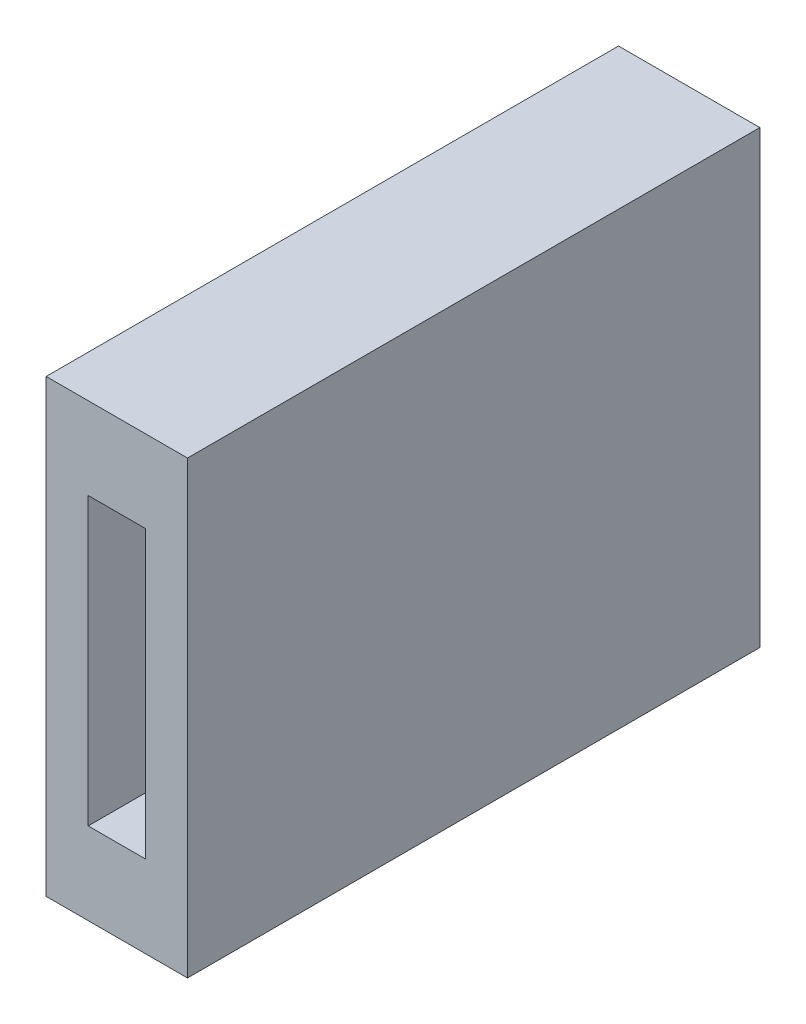
ISO-10303-21;
HEADER;
FILE_DESCRIPTION(('STEP AP214'),'2;1');
FILE_NAME('part.step','',(''),(''),'','','');
FILE_SCHEMA(('AUTOMOTIVE_DESIGN { 1 0 10303 214 1 1 1 1 }'));
ENDSEC;
DATA;
#1=APPLICATION_CONTEXT('core data for automotive mechanical design processes');
#2=APPLICATION_PROTOCOL_DEFINITION('international standard','automotive_design',2000,#1);
#3=PRODUCT_CONTEXT('',#1,'mechanical');
#4=PRODUCT('Part','Part','',(#3));
#5=PRODUCT_RELATED_PRODUCT_CATEGORY('part','',(#4));
#6=PRODUCT_DEFINITION_FORMATION('','',#4);
#7=PRODUCT_DEFINITION_CONTEXT('part definition',#1,'design');
#8=PRODUCT_DEFINITION('design','',#6,#7);
#9=PRODUCT_DEFINITION_SHAPE('','',#8);
#10=(LENGTH_UNIT() NAMED_UNIT(*) SI_UNIT(.MILLI.,.METRE.));
#11=(NAMED_UNIT(*) PLANE_ANGLE_UNIT() SI_UNIT($,.RADIAN.));
#12=(NAMED_UNIT(*) SI_UNIT($,.STERADIAN.) SOLID_ANGLE_UNIT());
#13=UNCERTAINTY_MEASURE_WITH_UNIT(LENGTH_MEASURE(1.E-05),#10,'distance_accuracy_value','');
#14=(GEOMETRIC_REPRESENTATION_CONTEXT(3) GLOBAL_UNCERTAINTY_ASSIGNED_CONTEXT((#13)) GLOBAL_UNIT_ASSIGNED_CONTEXT((#10,
#11,#12)) REPRESENTATION_CONTEXT('',''));
#15=CARTESIAN_POINT('',(0.,0.,0.));
#16=DIRECTION('',(0.,0.,1.));
#17=DIRECTION('',(1.,0.,0.));
#18=AXIS2_PLACEMENT_3D('',#15,#16,#17);
#19=CARTESIAN_POINT('',(0.,0.,50.));
#20=DIRECTION('',(0.,0.,-1.));
#21=DIRECTION('',(-1.,0.,0.));
#22=AXIS2_PLACEMENT_3D('',#19,#20,#21);
#23=PLANE('',#22);
#24=DIRECTION('',(0.,1.,0.));
#25=VECTOR('',#24,1.);
#26=CARTESIAN_POINT('',(6.1720698254364,-19.6695760598504,50.));
#27=LINE('',#26,#25);
#28=CARTESIAN_POINT('',(6.1720698254364,-19.6695760598504,50.));
#29=VERTEX_POINT('',#28);
#30=CARTESIAN_POINT('',(6.1720698254364,19.6695760598504,50.));
#31=VERTEX_POINT('',#30);
#32=EDGE_CURVE('E134',#29,#31,#27,.T.);
#33=ORIENTED_EDGE('',*,*,#32,.T.);
#34=DIRECTION('',(-1.,0.,0.));
#35=VECTOR('',#34,1.);
#36=CARTESIAN_POINT('',(-6.1720698254364,19.6695760598504,50.));
#37=LINE('',#36,#35);
#38=CARTESIAN_POINT('',(-6.1720698254364,19.6695760598504,50.));
#39=VERTEX_POINT('',#38);
#40=EDGE_CURVE('E137',#31,#39,#37,.T.);
#41=ORIENTED_EDGE('',*,*,#40,.T.);
#42=DIRECTION('',(0.,-1.,0.));
#43=VECTOR('',#42,1.);
#44=CARTESIAN_POINT('',(-6.1720698254364,-19.6695760598504,50.));
#45=LINE('',#44,#43);
#46=CARTESIAN_POINT('',(-6.1720698254364,-19.6695760598504,50.));
#47=VERTEX_POINT('',#46);
#48=EDGE_CURVE('E140',#39,#47,#45,.T.);
#49=ORIENTED_EDGE('',*,*,#48,.T.);
#50=DIRECTION('',(1.,0.,0.));
#51=VECTOR('',#50,1.);
#52=CARTESIAN_POINT('',(-6.1720698254364,-19.6695760598504,50.));
#53=LINE('',#52,#51);
#54=EDGE_CURVE('E142',#47,#29,#53,.T.);
#55=ORIENTED_EDGE('',*,*,#54,.T.);
#56=EDGE_LOOP('',(#33,#41,#49,#55));
#57=FACE_BOUND('',#56,.T.);
#58=DIRECTION('',(0.,1.,0.));
#59=VECTOR('',#58,1.);
#60=CARTESIAN_POINT('',(2.5,-12.5,50.));
#61=LINE('',#60,#59);
#62=CARTESIAN_POINT('',(2.5,-12.5,50.));
#63=VERTEX_POINT('',#62);
#64=CARTESIAN_POINT('',(2.5,12.5,50.));
#65=VERTEX_POINT('',#64);
#66=EDGE_CURVE('E98',#63,#65,#61,.T.);
#67=ORIENTED_EDGE('',*,*,#66,.F.);
#68=DIRECTION('',(1.,0.,0.));
#69=VECTOR('',#68,1.);
#70=CARTESIAN_POINT('',(-2.5,-12.5,50.));
#71=LINE('',#70,#69);
#72=CARTESIAN_POINT('',(-2.5,-12.5,50.));
#73=VERTEX_POINT('',#72);
#74=EDGE_CURVE('E120',#73,#63,#71,.T.);
#75=ORIENTED_EDGE('',*,*,#74,.F.);
#76=DIRECTION('',(0.,-1.,0.));
#77=VECTOR('',#76,1.);
#78=CARTESIAN_POINT('',(-2.5,-12.5,50.));
#79=LINE('',#78,#77);
#80=CARTESIAN_POINT('',(-2.5,12.5,50.));
#81=VERTEX_POINT('',#80);
#82=EDGE_CURVE('E118',#81,#73,#79,.T.);
#83=ORIENTED_EDGE('',*,*,#82,.F.);
#84=DIRECTION('',(-1.,0.,0.));
#85=VECTOR('',#84,1.);
#86=CARTESIAN_POINT('',(-2.5,12.5,50.));
#87=LINE('',#86,#85);
#88=EDGE_CURVE('E106',#65,#81,#87,.T.);
#89=ORIENTED_EDGE('',*,*,#88,.F.);
#90=EDGE_LOOP('',(#67,#75,#83,#89));
#91=FACE_BOUND('',#90,.T.);
#92=ADVANCED_FACE('F33',(#57,#91),#23,.F.);
#93=CARTESIAN_POINT('',(0.,0.,0.));
#94=DIRECTION('',(0.,0.,-1.));
#95=DIRECTION('',(-1.,0.,0.));
#96=AXIS2_PLACEMENT_3D('',#93,#94,#95);
#97=PLANE('',#96);
#98=DIRECTION('',(0.,1.,0.));
#99=VECTOR('',#98,1.);
#100=CARTESIAN_POINT('',(6.1720698254364,-19.6695760598504,0.));
#101=LINE('',#100,#99);
#102=CARTESIAN_POINT('',(6.1720698254364,-19.6695760598504,0.));
#103=VERTEX_POINT('',#102);
#104=CARTESIAN_POINT('',(6.1720698254364,19.6695760598504,0.));
#105=VERTEX_POINT('',#104);
#106=EDGE_CURVE('E114',#103,#105,#101,.T.);
#107=ORIENTED_EDGE('',*,*,#106,.F.);
#108=DIRECTION('',(1.,0.,0.));
#109=VECTOR('',#108,1.);
#110=CARTESIAN_POINT('',(-6.1720698254364,-19.6695760598504,0.));
#111=LINE('',#110,#109);
#112=CARTESIAN_POINT('',(-6.1720698254364,-19.6695760598504,0.));
#113=VERTEX_POINT('',#112);
#114=EDGE_CURVE('E138',#113,#103,#111,.T.);
#115=ORIENTED_EDGE('',*,*,#114,.F.);
#116=DIRECTION('',(0.,-1.,0.));
#117=VECTOR('',#116,1.);
#118=CARTESIAN_POINT('',(-6.1720698254364,-19.6695760598504,0.));
#119=LINE('',#118,#117);
#120=CARTESIAN_POINT('',(-6.1720698254364,19.6695760598504,0.));
#121=VERTEX_POINT('',#120);
#122=EDGE_CURVE('E149',#121,#113,#119,.T.);
#123=ORIENTED_EDGE('',*,*,#122,.F.);
#124=DIRECTION('',(-1.,0.,0.));
#125=VECTOR('',#124,1.);
#126=CARTESIAN_POINT('',(-6.1720698254364,19.6695760598504,0.));
#127=LINE('',#126,#125);
#128=EDGE_CURVE('E147',#105,#121,#127,.T.);
#129=ORIENTED_EDGE('',*,*,#128,.F.);
#130=EDGE_LOOP('',(#107,#115,#123,#129));
#131=FACE_BOUND('',#130,.T.);
#132=DIRECTION('',(1.,0.,0.));
#133=VECTOR('',#132,1.);
#134=CARTESIAN_POINT('',(-2.5,-12.5,0.));
#135=LINE('',#134,#133);
#136=CARTESIAN_POINT('',(-2.5,-12.5,0.));
#137=VERTEX_POINT('',#136);
#138=CARTESIAN_POINT('',(2.5,-12.5,0.));
#139=VERTEX_POINT('',#138);
#140=EDGE_CURVE('E107',#137,#139,#135,.T.);
#141=ORIENTED_EDGE('',*,*,#140,.T.);
#142=DIRECTION('',(0.,1.,0.));
#143=VECTOR('',#142,1.);
#144=CARTESIAN_POINT('',(2.5,-12.5,0.));
#145=LINE('',#144,#143);
#146=CARTESIAN_POINT('',(2.5,12.5,0.));
#147=VERTEX_POINT('',#146);
#148=EDGE_CURVE('E56',#139,#147,#145,.T.);
#149=ORIENTED_EDGE('',*,*,#148,.T.);
#150=DIRECTION('',(-1.,0.,0.));
#151=VECTOR('',#150,1.);
#152=CARTESIAN_POINT('',(-2.5,12.5,0.));
#153=LINE('',#152,#151);
#154=CARTESIAN_POINT('',(-2.5,12.5,0.));
#155=VERTEX_POINT('',#154);
#156=EDGE_CURVE('E113',#147,#155,#153,.T.);
#157=ORIENTED_EDGE('',*,*,#156,.T.);
#158=DIRECTION('',(0.,-1.,0.));
#159=VECTOR('',#158,1.);
#160=CARTESIAN_POINT('',(-2.5,-12.5,0.));
#161=LINE('',#160,#159);
#162=EDGE_CURVE('E126',#155,#137,#161,.T.);
#163=ORIENTED_EDGE('',*,*,#162,.T.);
#164=EDGE_LOOP('',(#141,#149,#157,#163));
#165=FACE_BOUND('',#164,.T.);
#166=ADVANCED_FACE('F167',(#131,#165),#97,.T.);
#167=CARTESIAN_POINT('',(6.1720698254364,-19.6695760598504,50.));
#168=DIRECTION('',(-1.,0.,0.));
#169=DIRECTION('',(0.,0.,1.));
#170=AXIS2_PLACEMENT_3D('',#167,#168,#169);
#171=PLANE('',#170);
#172=ORIENTED_EDGE('',*,*,#106,.T.);
#173=DIRECTION('',(0.,0.,-1.));
#174=VECTOR('',#173,1.);
#175=CARTESIAN_POINT('',(6.1720698254364,19.6695760598504,50.));
#176=LINE('',#175,#174);
#177=EDGE_CURVE('E11',#31,#105,#176,.T.);
#178=ORIENTED_EDGE('',*,*,#177,.F.);
#179=ORIENTED_EDGE('',*,*,#32,.F.);
#180=DIRECTION('',(0.,0.,-1.));
#181=VECTOR('',#180,1.);
#182=CARTESIAN_POINT('',(6.1720698254364,-19.6695760598504,50.));
#183=LINE('',#182,#181);
#184=EDGE_CURVE('E144',#29,#103,#183,.T.);
#185=ORIENTED_EDGE('',*,*,#184,.T.);
#186=EDGE_LOOP('',(#172,#178,#179,#185));
#187=FACE_BOUND('',#186,.T.);
#188=ADVANCED_FACE('F35',(#187),#171,.F.);
#189=CARTESIAN_POINT('',(-6.1720698254364,19.6695760598504,50.));
#190=DIRECTION('',(0.,-1.,0.));
#191=DIRECTION('',(0.,0.,-1.));
#192=AXIS2_PLACEMENT_3D('',#189,#190,#191);
#193=PLANE('',#192);
#194=ORIENTED_EDGE('',*,*,#128,.T.);
#195=DIRECTION('',(0.,0.,-1.));
#196=VECTOR('',#195,1.);
#197=CARTESIAN_POINT('',(-6.1720698254364,19.6695760598504,50.));
#198=LINE('',#197,#196);
#199=EDGE_CURVE('E41',#39,#121,#198,.T.);
#200=ORIENTED_EDGE('',*,*,#199,.F.);
#201=ORIENTED_EDGE('',*,*,#40,.F.);
#202=ORIENTED_EDGE('',*,*,#177,.T.);
#203=EDGE_LOOP('',(#194,#200,#201,#202));
#204=FACE_BOUND('',#203,.T.);
#205=ADVANCED_FACE('F177',(#204),#193,.F.);
#206=CARTESIAN_POINT('',(-6.1720698254364,-19.6695760598504,50.));
#207=DIRECTION('',(1.,0.,0.));
#208=DIRECTION('',(0.,0.,-1.));
#209=AXIS2_PLACEMENT_3D('',#206,#207,#208);
#210=PLANE('',#209);
#211=ORIENTED_EDGE('',*,*,#122,.T.);
#212=DIRECTION('',(0.,0.,-1.));
#213=VECTOR('',#212,1.);
#214=CARTESIAN_POINT('',(-6.1720698254364,-19.6695760598504,50.));
#215=LINE('',#214,#213);
#216=EDGE_CURVE('E154',#47,#113,#215,.T.);
#217=ORIENTED_EDGE('',*,*,#216,.F.);
#218=ORIENTED_EDGE('',*,*,#48,.F.);
#219=ORIENTED_EDGE('',*,*,#199,.T.);
#220=EDGE_LOOP('',(#211,#217,#218,#219));
#221=FACE_BOUND('',#220,.T.);
#222=ADVANCED_FACE('F161',(#221),#210,.F.);
#223=CARTESIAN_POINT('',(-6.1720698254364,-19.6695760598504,50.));
#224=DIRECTION('',(0.,1.,0.));
#225=DIRECTION('',(0.,0.,1.));
#226=AXIS2_PLACEMENT_3D('',#223,#224,#225);
#227=PLANE('',#226);
#228=ORIENTED_EDGE('',*,*,#114,.T.);
#229=ORIENTED_EDGE('',*,*,#184,.F.);
#230=ORIENTED_EDGE('',*,*,#54,.F.);
#231=ORIENTED_EDGE('',*,*,#216,.T.);
#232=EDGE_LOOP('',(#228,#229,#230,#231));
#233=FACE_BOUND('',#232,.T.);
#234=ADVANCED_FACE('F171',(#233),#227,.F.);
#235=CARTESIAN_POINT('',(2.5,-12.5,50.));
#236=DIRECTION('',(-1.,0.,0.));
#237=DIRECTION('',(0.,0.,1.));
#238=AXIS2_PLACEMENT_3D('',#235,#236,#237);
#239=PLANE('',#238);
#240=ORIENTED_EDGE('',*,*,#148,.F.);
#241=DIRECTION('',(0.,0.,-1.));
#242=VECTOR('',#241,1.);
#243=CARTESIAN_POINT('',(2.5,-12.5,50.));
#244=LINE('',#243,#242);
#245=EDGE_CURVE('E102',#63,#139,#244,.T.);
#246=ORIENTED_EDGE('',*,*,#245,.F.);
#247=ORIENTED_EDGE('',*,*,#66,.T.);
#248=DIRECTION('',(0.,0.,-1.));
#249=VECTOR('',#248,1.);
#250=CARTESIAN_POINT('',(2.5,12.5,50.));
#251=LINE('',#250,#249);
#252=EDGE_CURVE('E101',#65,#147,#251,.T.);
#253=ORIENTED_EDGE('',*,*,#252,.T.);
#254=EDGE_LOOP('',(#240,#246,#247,#253));
#255=FACE_BOUND('',#254,.T.);
#256=ADVANCED_FACE('F100',(#255),#239,.T.);
#257=CARTESIAN_POINT('',(-2.5,12.5,50.));
#258=DIRECTION('',(0.,-1.,0.));
#259=DIRECTION('',(0.,0.,-1.));
#260=AXIS2_PLACEMENT_3D('',#257,#258,#259);
#261=PLANE('',#260);
#262=ORIENTED_EDGE('',*,*,#156,.F.);
#263=ORIENTED_EDGE('',*,*,#252,.F.);
#264=ORIENTED_EDGE('',*,*,#88,.T.);
#265=DIRECTION('',(0.,0.,-1.));
#266=VECTOR('',#265,1.);
#267=CARTESIAN_POINT('',(-2.5,12.5,50.));
#268=LINE('',#267,#266);
#269=EDGE_CURVE('E115',#81,#155,#268,.T.);
#270=ORIENTED_EDGE('',*,*,#269,.T.);
#271=EDGE_LOOP('',(#262,#263,#264,#270));
#272=FACE_BOUND('',#271,.T.);
#273=ADVANCED_FACE('F110',(#272),#261,.T.);
#274=CARTESIAN_POINT('',(-2.5,-12.5,50.));
#275=DIRECTION('',(1.,0.,0.));
#276=DIRECTION('',(0.,0.,-1.));
#277=AXIS2_PLACEMENT_3D('',#274,#275,#276);
#278=PLANE('',#277);
#279=ORIENTED_EDGE('',*,*,#162,.F.);
#280=ORIENTED_EDGE('',*,*,#269,.F.);
#281=ORIENTED_EDGE('',*,*,#82,.T.);
#282=DIRECTION('',(0.,0.,-1.));
#283=VECTOR('',#282,1.);
#284=CARTESIAN_POINT('',(-2.5,-12.5,50.));
#285=LINE('',#284,#283);
#286=EDGE_CURVE('E48',#73,#137,#285,.T.);
#287=ORIENTED_EDGE('',*,*,#286,.T.);
#288=EDGE_LOOP('',(#279,#280,#281,#287));
#289=FACE_BOUND('',#288,.T.);
#290=ADVANCED_FACE('F200',(#289),#278,.T.);
#291=CARTESIAN_POINT('',(-2.5,-12.5,50.));
#292=DIRECTION('',(0.,1.,0.));
#293=DIRECTION('',(0.,0.,1.));
#294=AXIS2_PLACEMENT_3D('',#291,#292,#293);
#295=PLANE('',#294);
#296=ORIENTED_EDGE('',*,*,#140,.F.);
#297=ORIENTED_EDGE('',*,*,#286,.F.);
#298=ORIENTED_EDGE('',*,*,#74,.T.);
#299=ORIENTED_EDGE('',*,*,#245,.T.);
#300=EDGE_LOOP('',(#296,#297,#298,#299));
#301=FACE_BOUND('',#300,.T.);
#302=ADVANCED_FACE('F204',(#301),#295,.T.);
#303=CLOSED_SHELL('',(#92,#166,#188,#205,#222,#234,#256,#273,#290,#302));
#304=MANIFOLD_SOLID_BREP('B2',#303);
#305=ADVANCED_BREP_SHAPE_REPRESENTATION('',(#18,#304),#14);
#306=SHAPE_DEFINITION_REPRESENTATION(#9,#305);
ENDSEC;
END-ISO-10303-21;
